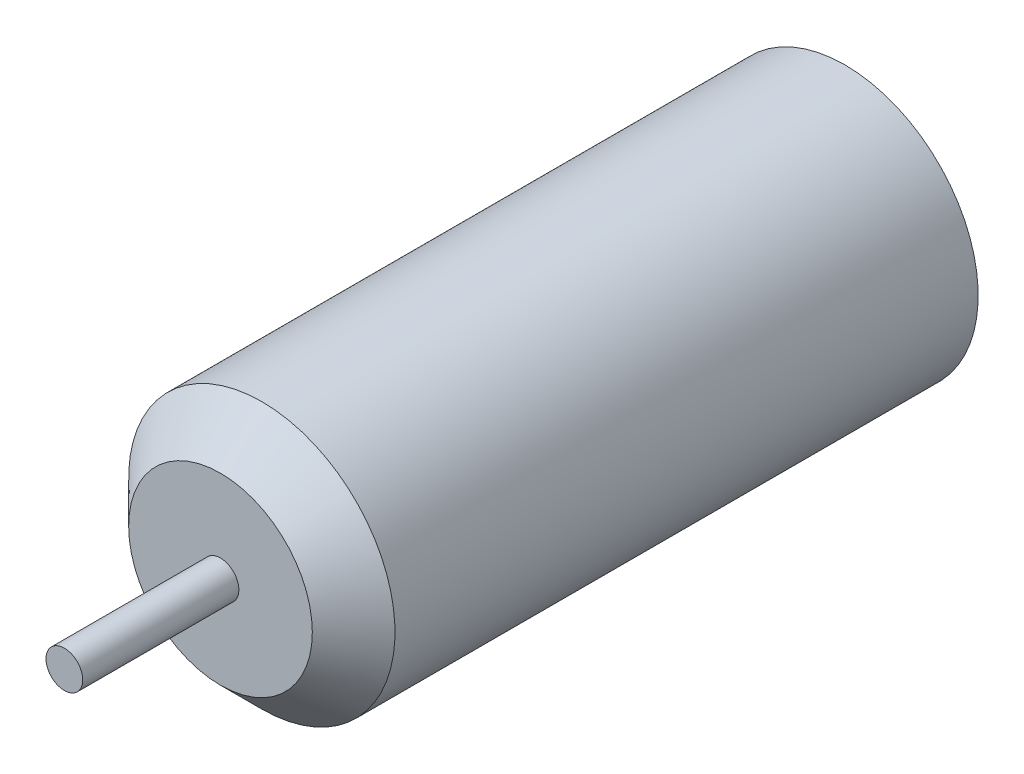
ISO-10303-21;
HEADER;
FILE_DESCRIPTION(('STEP AP214'),'2;1');
FILE_NAME('part.step','',(''),(''),'','','');
FILE_SCHEMA(('AUTOMOTIVE_DESIGN { 1 0 10303 214 1 1 1 1 }'));
ENDSEC;
DATA;
#1=APPLICATION_CONTEXT('core data for automotive mechanical design processes');
#2=APPLICATION_PROTOCOL_DEFINITION('international standard','automotive_design',2000,#1);
#3=PRODUCT_CONTEXT('',#1,'mechanical');
#4=PRODUCT('Part','Part','',(#3));
#5=PRODUCT_RELATED_PRODUCT_CATEGORY('part','',(#4));
#6=PRODUCT_DEFINITION_FORMATION('','',#4);
#7=PRODUCT_DEFINITION_CONTEXT('part definition',#1,'design');
#8=PRODUCT_DEFINITION('design','',#6,#7);
#9=PRODUCT_DEFINITION_SHAPE('','',#8);
#10=(LENGTH_UNIT() NAMED_UNIT(*) SI_UNIT(.MILLI.,.METRE.));
#11=(NAMED_UNIT(*) PLANE_ANGLE_UNIT() SI_UNIT($,.RADIAN.));
#12=(NAMED_UNIT(*) SI_UNIT($,.STERADIAN.) SOLID_ANGLE_UNIT());
#13=UNCERTAINTY_MEASURE_WITH_UNIT(LENGTH_MEASURE(1.E-05),#10,'distance_accuracy_value','');
#14=(GEOMETRIC_REPRESENTATION_CONTEXT(3) GLOBAL_UNCERTAINTY_ASSIGNED_CONTEXT((#13)) GLOBAL_UNIT_ASSIGNED_CONTEXT((#10,
#11,#12)) REPRESENTATION_CONTEXT('',''));
#15=CARTESIAN_POINT('',(0.,0.,0.));
#16=DIRECTION('',(0.,0.,1.));
#17=DIRECTION('',(1.,0.,0.));
#18=AXIS2_PLACEMENT_3D('',#15,#16,#17);
#19=CARTESIAN_POINT('',(0.,0.,0.));
#20=DIRECTION('',(0.,0.,1.));
#21=DIRECTION('',(0.,-1.,0.));
#22=AXIS2_PLACEMENT_3D('',#19,#20,#21);
#23=PLANE('',#22);
#24=CARTESIAN_POINT('',(0.,0.,0.));
#25=DIRECTION('',(0.,0.,-1.));
#26=DIRECTION('',(0.,1.,0.));
#27=AXIS2_PLACEMENT_3D('',#24,#25,#26);
#28=CIRCLE('',#27,2.);
#29=CARTESIAN_POINT('',(0.,2.,0.));
#30=VERTEX_POINT('',#29);
#31=EDGE_CURVE('E10',#30,#30,#28,.T.);
#32=ORIENTED_EDGE('',*,*,#31,.F.);
#33=EDGE_LOOP('',(#32));
#34=FACE_BOUND('',#33,.T.);
#35=ADVANCED_FACE('F31',(#34),#23,.T.);
#36=CARTESIAN_POINT('',(0.,0.,-85.));
#37=DIRECTION('',(0.,0.,-1.));
#38=DIRECTION('',(0.,1.,0.));
#39=AXIS2_PLACEMENT_3D('',#36,#37,#38);
#40=CYLINDRICAL_SURFACE('',#39,2.);
#41=ORIENTED_EDGE('',*,*,#31,.T.);
#42=EDGE_LOOP('',(#41));
#43=FACE_BOUND('',#42,.T.);
#44=CARTESIAN_POINT('',(0.,0.,-17.));
#45=DIRECTION('',(0.,0.,-1.));
#46=DIRECTION('',(0.,1.,0.));
#47=AXIS2_PLACEMENT_3D('',#44,#45,#46);
#48=CIRCLE('',#47,2.);
#49=CARTESIAN_POINT('',(0.,2.,-17.));
#50=VERTEX_POINT('',#49);
#51=EDGE_CURVE('E37',#50,#50,#48,.T.);
#52=ORIENTED_EDGE('',*,*,#51,.F.);
#53=EDGE_LOOP('',(#52));
#54=FACE_BOUND('',#53,.T.);
#55=ADVANCED_FACE('F70',(#43,#54),#40,.T.);
#56=CARTESIAN_POINT('',(0.,2.,-17.));
#57=DIRECTION('',(0.,0.,1.));
#58=DIRECTION('',(0.,-1.,0.));
#59=AXIS2_PLACEMENT_3D('',#56,#57,#58);
#60=PLANE('',#59);
#61=ORIENTED_EDGE('',*,*,#51,.T.);
#62=EDGE_LOOP('',(#61));
#63=FACE_BOUND('',#62,.T.);
#64=CARTESIAN_POINT('',(0.,0.,-17.));
#65=DIRECTION('',(0.,0.,-1.));
#66=DIRECTION('',(0.,1.,0.));
#67=AXIS2_PLACEMENT_3D('',#64,#65,#66);
#68=CIRCLE('',#67,10.);
#69=CARTESIAN_POINT('',(0.,10.,-17.));
#70=VERTEX_POINT('',#69);
#71=EDGE_CURVE('E41',#70,#70,#68,.T.);
#72=ORIENTED_EDGE('',*,*,#71,.F.);
#73=EDGE_LOOP('',(#72));
#74=FACE_BOUND('',#73,.T.);
#75=ADVANCED_FACE('F66',(#63,#74),#60,.T.);
#76=CARTESIAN_POINT('',(0.,0.,-21.5));
#77=DIRECTION('',(0.,0.,-1.));
#78=DIRECTION('',(0.,1.,0.));
#79=AXIS2_PLACEMENT_3D('',#76,#77,#78);
#80=CONICAL_SURFACE('',#79,14.5,0.785398163397447);
#81=ORIENTED_EDGE('',*,*,#71,.T.);
#82=EDGE_LOOP('',(#81));
#83=FACE_BOUND('',#82,.T.);
#84=CARTESIAN_POINT('',(0.,0.,-21.5));
#85=DIRECTION('',(0.,0.,-1.));
#86=DIRECTION('',(0.,1.,0.));
#87=AXIS2_PLACEMENT_3D('',#84,#85,#86);
#88=CIRCLE('',#87,14.5);
#89=CARTESIAN_POINT('',(0.,14.5,-21.5));
#90=VERTEX_POINT('',#89);
#91=EDGE_CURVE('E45',#90,#90,#88,.T.);
#92=ORIENTED_EDGE('',*,*,#91,.F.);
#93=EDGE_LOOP('',(#92));
#94=FACE_BOUND('',#93,.T.);
#95=ADVANCED_FACE('F58',(#83,#94),#80,.T.);
#96=CARTESIAN_POINT('',(0.,0.,-85.));
#97=DIRECTION('',(0.,0.,-1.));
#98=DIRECTION('',(0.,1.,0.));
#99=AXIS2_PLACEMENT_3D('',#96,#97,#98);
#100=CYLINDRICAL_SURFACE('',#99,14.5);
#101=ORIENTED_EDGE('',*,*,#91,.T.);
#102=EDGE_LOOP('',(#101));
#103=FACE_BOUND('',#102,.T.);
#104=CARTESIAN_POINT('',(0.,0.,-85.));
#105=DIRECTION('',(0.,0.,-1.));
#106=DIRECTION('',(0.,1.,0.));
#107=AXIS2_PLACEMENT_3D('',#104,#105,#106);
#108=CIRCLE('',#107,14.5);
#109=CARTESIAN_POINT('',(0.,14.5,-85.));
#110=VERTEX_POINT('',#109);
#111=EDGE_CURVE('E50',#110,#110,#108,.T.);
#112=ORIENTED_EDGE('',*,*,#111,.F.);
#113=EDGE_LOOP('',(#112));
#114=FACE_BOUND('',#113,.T.);
#115=ADVANCED_FACE('F56',(#103,#114),#100,.T.);
#116=CARTESIAN_POINT('',(0.,14.5,-85.));
#117=DIRECTION('',(0.,0.,-1.));
#118=DIRECTION('',(0.,1.,0.));
#119=AXIS2_PLACEMENT_3D('',#116,#117,#118);
#120=PLANE('',#119);
#121=ORIENTED_EDGE('',*,*,#111,.T.);
#122=EDGE_LOOP('',(#121));
#123=FACE_BOUND('',#122,.T.);
#124=ADVANCED_FACE('F54',(#123),#120,.T.);
#125=CLOSED_SHELL('',(#35,#55,#75,#95,#115,#124));
#126=MANIFOLD_SOLID_BREP('B2',#125);
#127=ADVANCED_BREP_SHAPE_REPRESENTATION('',(#18,#126),#14);
#128=SHAPE_DEFINITION_REPRESENTATION(#9,#127);
ENDSEC;
END-ISO-10303-21;
